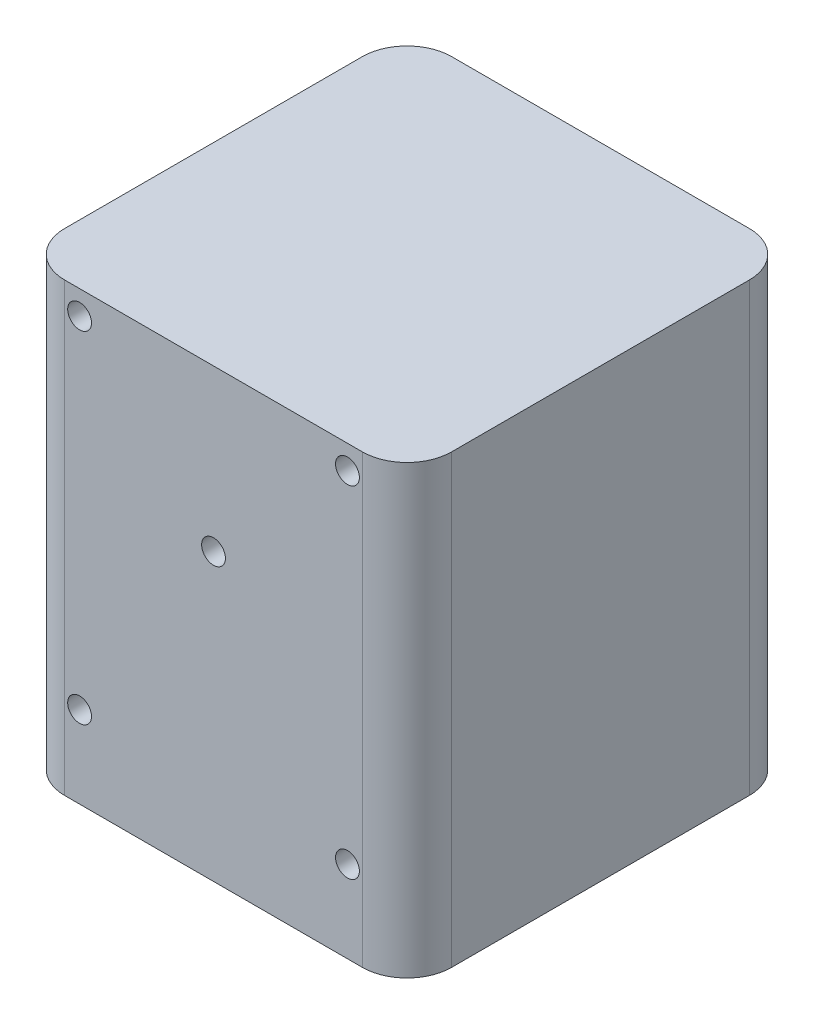
ISO-10303-21;
HEADER;
FILE_DESCRIPTION(('STEP AP214'),'2;1');
FILE_NAME('part.step','',(''),(''),'','','');
FILE_SCHEMA(('AUTOMOTIVE_DESIGN { 1 0 10303 214 1 1 1 1 }'));
ENDSEC;
DATA;
#1=APPLICATION_CONTEXT('core data for automotive mechanical design processes');
#2=APPLICATION_PROTOCOL_DEFINITION('international standard','automotive_design',2000,#1);
#3=PRODUCT_CONTEXT('',#1,'mechanical');
#4=PRODUCT('Part','Part','',(#3));
#5=PRODUCT_RELATED_PRODUCT_CATEGORY('part','',(#4));
#6=PRODUCT_DEFINITION_FORMATION('','',#4);
#7=PRODUCT_DEFINITION_CONTEXT('part definition',#1,'design');
#8=PRODUCT_DEFINITION('design','',#6,#7);
#9=PRODUCT_DEFINITION_SHAPE('','',#8);
#10=(LENGTH_UNIT() NAMED_UNIT(*) SI_UNIT(.MILLI.,.METRE.));
#11=(NAMED_UNIT(*) PLANE_ANGLE_UNIT() SI_UNIT($,.RADIAN.));
#12=(NAMED_UNIT(*) SI_UNIT($,.STERADIAN.) SOLID_ANGLE_UNIT());
#13=UNCERTAINTY_MEASURE_WITH_UNIT(LENGTH_MEASURE(1.E-05),#10,'distance_accuracy_value','');
#14=(GEOMETRIC_REPRESENTATION_CONTEXT(3) GLOBAL_UNCERTAINTY_ASSIGNED_CONTEXT((#13)) GLOBAL_UNIT_ASSIGNED_CONTEXT((#10,
#11,#12)) REPRESENTATION_CONTEXT('',''));
#15=CARTESIAN_POINT('',(0.,0.,0.));
#16=DIRECTION('',(0.,0.,1.));
#17=DIRECTION('',(1.,0.,0.));
#18=AXIS2_PLACEMENT_3D('',#15,#16,#17);
#19=CARTESIAN_POINT('',(-13.,15.,-13.));
#20=DIRECTION('',(0.,0.,1.));
#21=DIRECTION('',(1.,0.,0.));
#22=AXIS2_PLACEMENT_3D('',#19,#20,#21);
#23=PLANE('',#22);
#24=CARTESIAN_POINT('',(-9.,13.4,-13.));
#25=DIRECTION('',(0.,0.,-1.));
#26=DIRECTION('',(-1.,0.,0.));
#27=AXIS2_PLACEMENT_3D('',#24,#25,#26);
#28=CIRCLE('',#27,0.799999999999999);
#29=CARTESIAN_POINT('',(-9.8,13.4,-13.));
#30=VERTEX_POINT('',#29);
#31=EDGE_CURVE('E139',#30,#30,#28,.T.);
#32=ORIENTED_EDGE('',*,*,#31,.F.);
#33=EDGE_LOOP('',(#32));
#34=FACE_BOUND('',#33,.T.);
#35=CARTESIAN_POINT('',(9.,13.4,-13.));
#36=DIRECTION('',(0.,0.,-1.));
#37=DIRECTION('',(-1.,0.,0.));
#38=AXIS2_PLACEMENT_3D('',#35,#36,#37);
#39=CIRCLE('',#38,0.799999999999999);
#40=CARTESIAN_POINT('',(8.2,13.4,-13.));
#41=VERTEX_POINT('',#40);
#42=EDGE_CURVE('E138',#41,#41,#39,.T.);
#43=ORIENTED_EDGE('',*,*,#42,.F.);
#44=EDGE_LOOP('',(#43));
#45=FACE_BOUND('',#44,.T.);
#46=CARTESIAN_POINT('',(-9.,-9.5,-13.));
#47=DIRECTION('',(0.,0.,-1.));
#48=DIRECTION('',(-1.,0.,0.));
#49=AXIS2_PLACEMENT_3D('',#46,#47,#48);
#50=CIRCLE('',#49,0.799999999999999);
#51=CARTESIAN_POINT('',(-9.8,-9.5,-13.));
#52=VERTEX_POINT('',#51);
#53=EDGE_CURVE('E155',#52,#52,#50,.T.);
#54=ORIENTED_EDGE('',*,*,#53,.F.);
#55=EDGE_LOOP('',(#54));
#56=FACE_BOUND('',#55,.T.);
#57=CARTESIAN_POINT('',(9.,-9.5,-13.));
#58=DIRECTION('',(0.,0.,-1.));
#59=DIRECTION('',(-1.,0.,0.));
#60=AXIS2_PLACEMENT_3D('',#57,#58,#59);
#61=CIRCLE('',#60,0.799999999999999);
#62=CARTESIAN_POINT('',(8.2,-9.5,-13.));
#63=VERTEX_POINT('',#62);
#64=EDGE_CURVE('E161',#63,#63,#61,.T.);
#65=ORIENTED_EDGE('',*,*,#64,.F.);
#66=EDGE_LOOP('',(#65));
#67=FACE_BOUND('',#66,.T.);
#68=DIRECTION('',(-1.,0.,0.));
#69=VECTOR('',#68,1.);
#70=CARTESIAN_POINT('',(-13.,-15.,-13.));
#71=LINE('',#70,#69);
#72=CARTESIAN_POINT('',(9.99999999999999,-15.,-13.));
#73=VERTEX_POINT('',#72);
#74=CARTESIAN_POINT('',(-10.,-15.,-13.));
#75=VERTEX_POINT('',#74);
#76=EDGE_CURVE('E218',#73,#75,#71,.T.);
#77=ORIENTED_EDGE('',*,*,#76,.T.);
#78=DIRECTION('',(0.,-1.,0.));
#79=VECTOR('',#78,1.);
#80=CARTESIAN_POINT('',(-10.,15.,-13.));
#81=LINE('',#80,#79);
#82=CARTESIAN_POINT('',(-10.,15.,-13.));
#83=VERTEX_POINT('',#82);
#84=EDGE_CURVE('E240',#75,#83,#81,.F.);
#85=ORIENTED_EDGE('',*,*,#84,.T.);
#86=DIRECTION('',(-1.,0.,0.));
#87=VECTOR('',#86,1.);
#88=CARTESIAN_POINT('',(-13.,15.,-13.));
#89=LINE('',#88,#87);
#90=CARTESIAN_POINT('',(9.99999999999999,15.,-13.));
#91=VERTEX_POINT('',#90);
#92=EDGE_CURVE('E207',#91,#83,#89,.T.);
#93=ORIENTED_EDGE('',*,*,#92,.F.);
#94=DIRECTION('',(0.,-1.,0.));
#95=VECTOR('',#94,1.);
#96=CARTESIAN_POINT('',(9.99999999999999,15.,-13.));
#97=LINE('',#96,#95);
#98=EDGE_CURVE('E237',#91,#73,#97,.T.);
#99=ORIENTED_EDGE('',*,*,#98,.T.);
#100=EDGE_LOOP('',(#77,#85,#93,#99));
#101=FACE_BOUND('',#100,.T.);
#102=CARTESIAN_POINT('',(0.,4.2,-13.));
#103=DIRECTION('',(0.,0.,-1.));
#104=DIRECTION('',(-1.,0.,0.));
#105=AXIS2_PLACEMENT_3D('',#102,#103,#104);
#106=CIRCLE('',#105,0.799999999999998);
#107=CARTESIAN_POINT('',(-0.799999999999998,4.2,-13.));
#108=VERTEX_POINT('',#107);
#109=EDGE_CURVE('E149',#108,#108,#106,.T.);
#110=ORIENTED_EDGE('',*,*,#109,.F.);
#111=EDGE_LOOP('',(#110));
#112=FACE_BOUND('',#111,.T.);
#113=ADVANCED_FACE('F34',(#34,#45,#56,#67,#101,#112),#23,.F.);
#114=CARTESIAN_POINT('',(13.,15.,-13.));
#115=DIRECTION('',(-1.,0.,0.));
#116=DIRECTION('',(0.,0.,1.));
#117=AXIS2_PLACEMENT_3D('',#114,#115,#116);
#118=PLANE('',#117);
#119=DIRECTION('',(0.,0.,-1.));
#120=VECTOR('',#119,1.);
#121=CARTESIAN_POINT('',(13.,-15.,-13.));
#122=LINE('',#121,#120);
#123=CARTESIAN_POINT('',(13.,-15.,9.99999999999999));
#124=VERTEX_POINT('',#123);
#125=CARTESIAN_POINT('',(13.,-15.,-10.));
#126=VERTEX_POINT('',#125);
#127=EDGE_CURVE('E201',#124,#126,#122,.T.);
#128=ORIENTED_EDGE('',*,*,#127,.T.);
#129=DIRECTION('',(0.,-1.,0.));
#130=VECTOR('',#129,1.);
#131=CARTESIAN_POINT('',(13.,15.,-10.));
#132=LINE('',#131,#130);
#133=CARTESIAN_POINT('',(13.,15.,-10.));
#134=VERTEX_POINT('',#133);
#135=EDGE_CURVE('E252',#126,#134,#132,.F.);
#136=ORIENTED_EDGE('',*,*,#135,.T.);
#137=DIRECTION('',(0.,0.,-1.));
#138=VECTOR('',#137,1.);
#139=CARTESIAN_POINT('',(13.,15.,-13.));
#140=LINE('',#139,#138);
#141=CARTESIAN_POINT('',(13.,15.,9.99999999999999));
#142=VERTEX_POINT('',#141);
#143=EDGE_CURVE('E204',#142,#134,#140,.T.);
#144=ORIENTED_EDGE('',*,*,#143,.F.);
#145=DIRECTION('',(0.,-1.,0.));
#146=VECTOR('',#145,1.);
#147=CARTESIAN_POINT('',(13.,15.,10.));
#148=LINE('',#147,#146);
#149=EDGE_CURVE('E249',#142,#124,#148,.T.);
#150=ORIENTED_EDGE('',*,*,#149,.T.);
#151=EDGE_LOOP('',(#128,#136,#144,#150));
#152=FACE_BOUND('',#151,.T.);
#153=ADVANCED_FACE('F256',(#152),#118,.F.);
#154=CARTESIAN_POINT('',(-13.,15.,-13.));
#155=DIRECTION('',(1.,0.,0.));
#156=DIRECTION('',(0.,0.,-1.));
#157=AXIS2_PLACEMENT_3D('',#154,#155,#156);
#158=PLANE('',#157);
#159=DIRECTION('',(0.,0.,1.));
#160=VECTOR('',#159,1.);
#161=CARTESIAN_POINT('',(-13.,15.,-13.));
#162=LINE('',#161,#160);
#163=CARTESIAN_POINT('',(-13.,15.,-10.));
#164=VERTEX_POINT('',#163);
#165=CARTESIAN_POINT('',(-13.,15.,9.99999999999999));
#166=VERTEX_POINT('',#165);
#167=EDGE_CURVE('E211',#164,#166,#162,.T.);
#168=ORIENTED_EDGE('',*,*,#167,.F.);
#169=DIRECTION('',(0.,-1.,0.));
#170=VECTOR('',#169,1.);
#171=CARTESIAN_POINT('',(-13.,15.,-10.));
#172=LINE('',#171,#170);
#173=CARTESIAN_POINT('',(-13.,-15.,-10.));
#174=VERTEX_POINT('',#173);
#175=EDGE_CURVE('E226',#164,#174,#172,.T.);
#176=ORIENTED_EDGE('',*,*,#175,.T.);
#177=DIRECTION('',(0.,0.,1.));
#178=VECTOR('',#177,1.);
#179=CARTESIAN_POINT('',(-13.,-15.,-13.));
#180=LINE('',#179,#178);
#181=CARTESIAN_POINT('',(-13.,-15.,9.99999999999999));
#182=VERTEX_POINT('',#181);
#183=EDGE_CURVE('E221',#174,#182,#180,.T.);
#184=ORIENTED_EDGE('',*,*,#183,.T.);
#185=DIRECTION('',(0.,-1.,0.));
#186=VECTOR('',#185,1.);
#187=CARTESIAN_POINT('',(-13.,15.,10.));
#188=LINE('',#187,#186);
#189=EDGE_CURVE('E215',#182,#166,#188,.F.);
#190=ORIENTED_EDGE('',*,*,#189,.T.);
#191=EDGE_LOOP('',(#168,#176,#184,#190));
#192=FACE_BOUND('',#191,.T.);
#193=ADVANCED_FACE('F279',(#192),#158,.F.);
#194=CARTESIAN_POINT('',(-13.,15.,13.));
#195=DIRECTION('',(0.,0.,-1.));
#196=DIRECTION('',(-1.,0.,0.));
#197=AXIS2_PLACEMENT_3D('',#194,#195,#196);
#198=PLANE('',#197);
#199=CARTESIAN_POINT('',(-9.,13.4,13.));
#200=DIRECTION('',(0.,0.,1.));
#201=DIRECTION('',(1.,0.,0.));
#202=AXIS2_PLACEMENT_3D('',#199,#200,#201);
#203=CIRCLE('',#202,0.799999999999999);
#204=CARTESIAN_POINT('',(-8.2,13.4,13.));
#205=VERTEX_POINT('',#204);
#206=EDGE_CURVE('E167',#205,#205,#203,.T.);
#207=ORIENTED_EDGE('',*,*,#206,.F.);
#208=EDGE_LOOP('',(#207));
#209=FACE_BOUND('',#208,.T.);
#210=CARTESIAN_POINT('',(9.,13.4,13.));
#211=DIRECTION('',(0.,0.,1.));
#212=DIRECTION('',(1.,0.,0.));
#213=AXIS2_PLACEMENT_3D('',#210,#211,#212);
#214=CIRCLE('',#213,0.799999999999999);
#215=CARTESIAN_POINT('',(9.8,13.4,13.));
#216=VERTEX_POINT('',#215);
#217=EDGE_CURVE('E173',#216,#216,#214,.T.);
#218=ORIENTED_EDGE('',*,*,#217,.F.);
#219=EDGE_LOOP('',(#218));
#220=FACE_BOUND('',#219,.T.);
#221=CARTESIAN_POINT('',(0.,4.2,13.));
#222=DIRECTION('',(0.,0.,1.));
#223=DIRECTION('',(1.,0.,0.));
#224=AXIS2_PLACEMENT_3D('',#221,#222,#223);
#225=CIRCLE('',#224,0.799999999999998);
#226=CARTESIAN_POINT('',(0.799999999999998,4.2,13.));
#227=VERTEX_POINT('',#226);
#228=EDGE_CURVE('E179',#227,#227,#225,.T.);
#229=ORIENTED_EDGE('',*,*,#228,.F.);
#230=EDGE_LOOP('',(#229));
#231=FACE_BOUND('',#230,.T.);
#232=CARTESIAN_POINT('',(-9.,-9.5,13.));
#233=DIRECTION('',(0.,0.,1.));
#234=DIRECTION('',(1.,0.,0.));
#235=AXIS2_PLACEMENT_3D('',#232,#233,#234);
#236=CIRCLE('',#235,0.799999999999999);
#237=CARTESIAN_POINT('',(-8.2,-9.5,13.));
#238=VERTEX_POINT('',#237);
#239=EDGE_CURVE('E185',#238,#238,#236,.T.);
#240=ORIENTED_EDGE('',*,*,#239,.F.);
#241=EDGE_LOOP('',(#240));
#242=FACE_BOUND('',#241,.T.);
#243=CARTESIAN_POINT('',(9.,-9.5,13.));
#244=DIRECTION('',(0.,0.,1.));
#245=DIRECTION('',(1.,0.,0.));
#246=AXIS2_PLACEMENT_3D('',#243,#244,#245);
#247=CIRCLE('',#246,0.799999999999999);
#248=CARTESIAN_POINT('',(9.8,-9.5,13.));
#249=VERTEX_POINT('',#248);
#250=EDGE_CURVE('E191',#249,#249,#247,.T.);
#251=ORIENTED_EDGE('',*,*,#250,.F.);
#252=EDGE_LOOP('',(#251));
#253=FACE_BOUND('',#252,.T.);
#254=DIRECTION('',(1.,0.,0.));
#255=VECTOR('',#254,1.);
#256=CARTESIAN_POINT('',(-13.,15.,13.));
#257=LINE('',#256,#255);
#258=CARTESIAN_POINT('',(-10.,15.,13.));
#259=VERTEX_POINT('',#258);
#260=CARTESIAN_POINT('',(9.99999999999999,15.,13.));
#261=VERTEX_POINT('',#260);
#262=EDGE_CURVE('E213',#259,#261,#257,.T.);
#263=ORIENTED_EDGE('',*,*,#262,.F.);
#264=DIRECTION('',(0.,-1.,0.));
#265=VECTOR('',#264,1.);
#266=CARTESIAN_POINT('',(-10.,15.,13.));
#267=LINE('',#266,#265);
#268=CARTESIAN_POINT('',(-10.,-15.,13.));
#269=VERTEX_POINT('',#268);
#270=EDGE_CURVE('E11',#259,#269,#267,.T.);
#271=ORIENTED_EDGE('',*,*,#270,.T.);
#272=DIRECTION('',(1.,0.,0.));
#273=VECTOR('',#272,1.);
#274=CARTESIAN_POINT('',(-13.,-15.,13.));
#275=LINE('',#274,#273);
#276=CARTESIAN_POINT('',(9.99999999999999,-15.,13.));
#277=VERTEX_POINT('',#276);
#278=EDGE_CURVE('E208',#269,#277,#275,.T.);
#279=ORIENTED_EDGE('',*,*,#278,.T.);
#280=DIRECTION('',(0.,-1.,0.));
#281=VECTOR('',#280,1.);
#282=CARTESIAN_POINT('',(10.,15.,13.));
#283=LINE('',#282,#281);
#284=EDGE_CURVE('E42',#277,#261,#283,.F.);
#285=ORIENTED_EDGE('',*,*,#284,.T.);
#286=EDGE_LOOP('',(#263,#271,#279,#285));
#287=FACE_BOUND('',#286,.T.);
#288=ADVANCED_FACE('F285',(#209,#220,#231,#242,#253,#287),#198,.F.);
#289=CARTESIAN_POINT('',(0.,15.,0.));
#290=DIRECTION('',(0.,1.,0.));
#291=DIRECTION('',(0.,0.,1.));
#292=AXIS2_PLACEMENT_3D('',#289,#290,#291);
#293=PLANE('',#292);
#294=ORIENTED_EDGE('',*,*,#92,.T.);
#295=CARTESIAN_POINT('',(-10.,15.,-10.));
#296=DIRECTION('',(0.,1.,0.));
#297=DIRECTION('',(0.,0.,1.));
#298=AXIS2_PLACEMENT_3D('',#295,#296,#297);
#299=CIRCLE('',#298,3.);
#300=EDGE_CURVE('E247',#83,#164,#299,.T.);
#301=ORIENTED_EDGE('',*,*,#300,.T.);
#302=ORIENTED_EDGE('',*,*,#167,.T.);
#303=CARTESIAN_POINT('',(-10.,15.,10.));
#304=DIRECTION('',(0.,1.,0.));
#305=DIRECTION('',(0.,0.,1.));
#306=AXIS2_PLACEMENT_3D('',#303,#304,#305);
#307=CIRCLE('',#306,3.);
#308=EDGE_CURVE('E55',#166,#259,#307,.T.);
#309=ORIENTED_EDGE('',*,*,#308,.T.);
#310=ORIENTED_EDGE('',*,*,#262,.T.);
#311=CARTESIAN_POINT('',(10.,15.,10.));
#312=DIRECTION('',(0.,1.,0.));
#313=DIRECTION('',(0.,0.,1.));
#314=AXIS2_PLACEMENT_3D('',#311,#312,#313);
#315=CIRCLE('',#314,3.);
#316=EDGE_CURVE('E242',#261,#142,#315,.T.);
#317=ORIENTED_EDGE('',*,*,#316,.T.);
#318=ORIENTED_EDGE('',*,*,#143,.T.);
#319=CARTESIAN_POINT('',(9.99999999999999,15.,-10.));
#320=DIRECTION('',(0.,1.,0.));
#321=DIRECTION('',(0.,0.,1.));
#322=AXIS2_PLACEMENT_3D('',#319,#320,#321);
#323=CIRCLE('',#322,3.);
#324=EDGE_CURVE('E245',#134,#91,#323,.T.);
#325=ORIENTED_EDGE('',*,*,#324,.T.);
#326=EDGE_LOOP('',(#294,#301,#302,#309,#310,#317,#318,#325));
#327=FACE_BOUND('',#326,.T.);
#328=ADVANCED_FACE('F261',(#327),#293,.T.);
#329=CARTESIAN_POINT('',(0.,-15.,0.));
#330=DIRECTION('',(0.,1.,0.));
#331=DIRECTION('',(0.,0.,1.));
#332=AXIS2_PLACEMENT_3D('',#329,#330,#331);
#333=PLANE('',#332);
#334=CARTESIAN_POINT('',(0.,-15.,0.));
#335=DIRECTION('',(0.,-1.,0.));
#336=DIRECTION('',(0.,0.,-1.));
#337=AXIS2_PLACEMENT_3D('',#334,#335,#336);
#338=CIRCLE('',#337,12.);
#339=CARTESIAN_POINT('',(0.,-15.,-12.));
#340=VERTEX_POINT('',#339);
#341=EDGE_CURVE('E197',#340,#340,#338,.T.);
#342=ORIENTED_EDGE('',*,*,#341,.F.);
#343=EDGE_LOOP('',(#342));
#344=FACE_BOUND('',#343,.T.);
#345=ORIENTED_EDGE('',*,*,#183,.F.);
#346=CARTESIAN_POINT('',(-10.,-15.,-10.));
#347=DIRECTION('',(0.,1.,0.));
#348=DIRECTION('',(0.,0.,1.));
#349=AXIS2_PLACEMENT_3D('',#346,#347,#348);
#350=CIRCLE('',#349,3.);
#351=EDGE_CURVE('E235',#174,#75,#350,.F.);
#352=ORIENTED_EDGE('',*,*,#351,.T.);
#353=ORIENTED_EDGE('',*,*,#76,.F.);
#354=CARTESIAN_POINT('',(9.99999999999999,-15.,-10.));
#355=DIRECTION('',(0.,1.,0.));
#356=DIRECTION('',(0.,0.,1.));
#357=AXIS2_PLACEMENT_3D('',#354,#355,#356);
#358=CIRCLE('',#357,3.);
#359=EDGE_CURVE('E233',#73,#126,#358,.F.);
#360=ORIENTED_EDGE('',*,*,#359,.T.);
#361=ORIENTED_EDGE('',*,*,#127,.F.);
#362=CARTESIAN_POINT('',(10.,-15.,10.));
#363=DIRECTION('',(0.,1.,0.));
#364=DIRECTION('',(0.,0.,1.));
#365=AXIS2_PLACEMENT_3D('',#362,#363,#364);
#366=CIRCLE('',#365,3.);
#367=EDGE_CURVE('E229',#124,#277,#366,.F.);
#368=ORIENTED_EDGE('',*,*,#367,.T.);
#369=ORIENTED_EDGE('',*,*,#278,.F.);
#370=CARTESIAN_POINT('',(-10.,-15.,10.));
#371=DIRECTION('',(0.,1.,0.));
#372=DIRECTION('',(0.,0.,1.));
#373=AXIS2_PLACEMENT_3D('',#370,#371,#372);
#374=CIRCLE('',#373,3.);
#375=EDGE_CURVE('E231',#269,#182,#374,.F.);
#376=ORIENTED_EDGE('',*,*,#375,.T.);
#377=EDGE_LOOP('',(#345,#352,#353,#360,#361,#368,#369,#376));
#378=FACE_BOUND('',#377,.T.);
#379=ADVANCED_FACE('F272',(#344,#378),#333,.F.);
#380=CARTESIAN_POINT('',(-10.,15.,-10.));
#381=DIRECTION('',(0.,-1.,0.));
#382=DIRECTION('',(0.,0.,-1.));
#383=AXIS2_PLACEMENT_3D('',#380,#381,#382);
#384=CYLINDRICAL_SURFACE('',#383,3.);
#385=ORIENTED_EDGE('',*,*,#300,.F.);
#386=ORIENTED_EDGE('',*,*,#84,.F.);
#387=ORIENTED_EDGE('',*,*,#351,.F.);
#388=ORIENTED_EDGE('',*,*,#175,.F.);
#389=EDGE_LOOP('',(#385,#386,#387,#388));
#390=FACE_BOUND('',#389,.T.);
#391=ADVANCED_FACE('F276',(#390),#384,.T.);
#392=CARTESIAN_POINT('',(9.99999999999999,15.,-10.));
#393=DIRECTION('',(0.,-1.,0.));
#394=DIRECTION('',(0.,0.,-1.));
#395=AXIS2_PLACEMENT_3D('',#392,#393,#394);
#396=CYLINDRICAL_SURFACE('',#395,3.);
#397=ORIENTED_EDGE('',*,*,#324,.F.);
#398=ORIENTED_EDGE('',*,*,#135,.F.);
#399=ORIENTED_EDGE('',*,*,#359,.F.);
#400=ORIENTED_EDGE('',*,*,#98,.F.);
#401=EDGE_LOOP('',(#397,#398,#399,#400));
#402=FACE_BOUND('',#401,.T.);
#403=ADVANCED_FACE('F265',(#402),#396,.T.);
#404=CARTESIAN_POINT('',(-10.,15.,10.));
#405=DIRECTION('',(0.,-1.,0.));
#406=DIRECTION('',(0.,0.,-1.));
#407=AXIS2_PLACEMENT_3D('',#404,#405,#406);
#408=CYLINDRICAL_SURFACE('',#407,3.);
#409=ORIENTED_EDGE('',*,*,#308,.F.);
#410=ORIENTED_EDGE('',*,*,#189,.F.);
#411=ORIENTED_EDGE('',*,*,#375,.F.);
#412=ORIENTED_EDGE('',*,*,#270,.F.);
#413=EDGE_LOOP('',(#409,#410,#411,#412));
#414=FACE_BOUND('',#413,.T.);
#415=ADVANCED_FACE('F283',(#414),#408,.T.);
#416=CARTESIAN_POINT('',(10.,15.,10.));
#417=DIRECTION('',(0.,-1.,0.));
#418=DIRECTION('',(0.,0.,-1.));
#419=AXIS2_PLACEMENT_3D('',#416,#417,#418);
#420=CYLINDRICAL_SURFACE('',#419,3.);
#421=ORIENTED_EDGE('',*,*,#316,.F.);
#422=ORIENTED_EDGE('',*,*,#284,.F.);
#423=ORIENTED_EDGE('',*,*,#367,.F.);
#424=ORIENTED_EDGE('',*,*,#149,.F.);
#425=EDGE_LOOP('',(#421,#422,#423,#424));
#426=FACE_BOUND('',#425,.T.);
#427=ADVANCED_FACE('F36',(#426),#420,.T.);
#428=CARTESIAN_POINT('',(0.,-5.,0.));
#429=DIRECTION('',(0.,-1.,0.));
#430=DIRECTION('',(0.,0.,-1.));
#431=AXIS2_PLACEMENT_3D('',#428,#429,#430);
#432=CYLINDRICAL_SURFACE('',#431,12.);
#433=CARTESIAN_POINT('',(0.,-5.,0.));
#434=DIRECTION('',(0.,-1.,0.));
#435=DIRECTION('',(0.,0.,-1.));
#436=AXIS2_PLACEMENT_3D('',#433,#434,#435);
#437=CIRCLE('',#436,12.);
#438=CARTESIAN_POINT('',(0.,-5.,-12.));
#439=VERTEX_POINT('',#438);
#440=EDGE_CURVE('E198',#439,#439,#437,.T.);
#441=ORIENTED_EDGE('',*,*,#440,.F.);
#442=EDGE_LOOP('',(#441));
#443=FACE_BOUND('',#442,.T.);
#444=ORIENTED_EDGE('',*,*,#341,.T.);
#445=EDGE_LOOP('',(#444));
#446=FACE_BOUND('',#445,.T.);
#447=ADVANCED_FACE('F288',(#443,#446),#432,.F.);
#448=CARTESIAN_POINT('',(0.,-5.,0.));
#449=DIRECTION('',(0.,-1.,0.));
#450=DIRECTION('',(0.,0.,-1.));
#451=AXIS2_PLACEMENT_3D('',#448,#449,#450);
#452=PLANE('',#451);
#453=ORIENTED_EDGE('',*,*,#440,.T.);
#454=EDGE_LOOP('',(#453));
#455=FACE_BOUND('',#454,.T.);
#456=ADVANCED_FACE('F293',(#455),#452,.T.);
#457=CARTESIAN_POINT('',(9.,-9.5,10.5));
#458=DIRECTION('',(0.,0.,1.));
#459=DIRECTION('',(1.,0.,0.));
#460=AXIS2_PLACEMENT_3D('',#457,#458,#459);
#461=CONICAL_SURFACE('',#460,0.799999999999999,1.02974425867665);
#462=CARTESIAN_POINT('',(9.,-9.5,10.019311504778));
#463=VERTEX_POINT('',#462);
#464=VERTEX_LOOP('',#463);
#465=FACE_BOUND('',#464,.T.);
#466=CARTESIAN_POINT('',(9.,-9.5,10.5));
#467=DIRECTION('',(0.,0.,1.));
#468=DIRECTION('',(1.,0.,0.));
#469=AXIS2_PLACEMENT_3D('',#466,#467,#468);
#470=CIRCLE('',#469,0.799999999999999);
#471=CARTESIAN_POINT('',(9.8,-9.5,10.5));
#472=VERTEX_POINT('',#471);
#473=EDGE_CURVE('E194',#472,#472,#470,.T.);
#474=ORIENTED_EDGE('',*,*,#473,.T.);
#475=EDGE_LOOP('',(#474));
#476=FACE_BOUND('',#475,.T.);
#477=ADVANCED_FACE('F351',(#465,#476),#461,.F.);
#478=CARTESIAN_POINT('',(9.,-9.5,13.));
#479=DIRECTION('',(0.,0.,1.));
#480=DIRECTION('',(1.,0.,0.));
#481=AXIS2_PLACEMENT_3D('',#478,#479,#480);
#482=CYLINDRICAL_SURFACE('',#481,0.799999999999999);
#483=ORIENTED_EDGE('',*,*,#473,.F.);
#484=EDGE_LOOP('',(#483));
#485=FACE_BOUND('',#484,.T.);
#486=ORIENTED_EDGE('',*,*,#250,.T.);
#487=EDGE_LOOP('',(#486));
#488=FACE_BOUND('',#487,.T.);
#489=ADVANCED_FACE('F372',(#485,#488),#482,.F.);
#490=CARTESIAN_POINT('',(-9.,-9.5,10.5));
#491=DIRECTION('',(0.,0.,1.));
#492=DIRECTION('',(1.,0.,0.));
#493=AXIS2_PLACEMENT_3D('',#490,#491,#492);
#494=CONICAL_SURFACE('',#493,0.799999999999999,1.02974425867665);
#495=CARTESIAN_POINT('',(-9.,-9.5,10.019311504778));
#496=VERTEX_POINT('',#495);
#497=VERTEX_LOOP('',#496);
#498=FACE_BOUND('',#497,.T.);
#499=CARTESIAN_POINT('',(-9.,-9.5,10.5));
#500=DIRECTION('',(0.,0.,1.));
#501=DIRECTION('',(1.,0.,0.));
#502=AXIS2_PLACEMENT_3D('',#499,#500,#501);
#503=CIRCLE('',#502,0.799999999999999);
#504=CARTESIAN_POINT('',(-8.2,-9.5,10.5));
#505=VERTEX_POINT('',#504);
#506=EDGE_CURVE('E188',#505,#505,#503,.T.);
#507=ORIENTED_EDGE('',*,*,#506,.T.);
#508=EDGE_LOOP('',(#507));
#509=FACE_BOUND('',#508,.T.);
#510=ADVANCED_FACE('F383',(#498,#509),#494,.F.);
#511=CARTESIAN_POINT('',(-9.,-9.5,13.));
#512=DIRECTION('',(0.,0.,1.));
#513=DIRECTION('',(1.,0.,0.));
#514=AXIS2_PLACEMENT_3D('',#511,#512,#513);
#515=CYLINDRICAL_SURFACE('',#514,0.799999999999999);
#516=ORIENTED_EDGE('',*,*,#506,.F.);
#517=EDGE_LOOP('',(#516));
#518=FACE_BOUND('',#517,.T.);
#519=ORIENTED_EDGE('',*,*,#239,.T.);
#520=EDGE_LOOP('',(#519));
#521=FACE_BOUND('',#520,.T.);
#522=ADVANCED_FACE('F394',(#518,#521),#515,.F.);
#523=CARTESIAN_POINT('',(0.,4.2,10.5));
#524=DIRECTION('',(0.,0.,1.));
#525=DIRECTION('',(1.,0.,0.));
#526=AXIS2_PLACEMENT_3D('',#523,#524,#525);
#527=CONICAL_SURFACE('',#526,0.799999999999999,1.02974425867665);
#528=CARTESIAN_POINT('',(0.,4.2,10.019311504778));
#529=VERTEX_POINT('',#528);
#530=VERTEX_LOOP('',#529);
#531=FACE_BOUND('',#530,.T.);
#532=CARTESIAN_POINT('',(0.,4.2,10.5));
#533=DIRECTION('',(0.,0.,1.));
#534=DIRECTION('',(1.,0.,0.));
#535=AXIS2_PLACEMENT_3D('',#532,#533,#534);
#536=CIRCLE('',#535,0.799999999999999);
#537=CARTESIAN_POINT('',(0.799999999999999,4.2,10.5));
#538=VERTEX_POINT('',#537);
#539=EDGE_CURVE('E182',#538,#538,#536,.T.);
#540=ORIENTED_EDGE('',*,*,#539,.T.);
#541=EDGE_LOOP('',(#540));
#542=FACE_BOUND('',#541,.T.);
#543=ADVANCED_FACE('F404',(#531,#542),#527,.F.);
#544=CARTESIAN_POINT('',(0.,4.2,13.));
#545=DIRECTION('',(0.,0.,1.));
#546=DIRECTION('',(1.,0.,0.));
#547=AXIS2_PLACEMENT_3D('',#544,#545,#546);
#548=CYLINDRICAL_SURFACE('',#547,0.799999999999999);
#549=ORIENTED_EDGE('',*,*,#539,.F.);
#550=EDGE_LOOP('',(#549));
#551=FACE_BOUND('',#550,.T.);
#552=ORIENTED_EDGE('',*,*,#228,.T.);
#553=EDGE_LOOP('',(#552));
#554=FACE_BOUND('',#553,.T.);
#555=ADVANCED_FACE('F415',(#551,#554),#548,.F.);
#556=CARTESIAN_POINT('',(9.,13.4,10.5));
#557=DIRECTION('',(0.,0.,1.));
#558=DIRECTION('',(1.,0.,0.));
#559=AXIS2_PLACEMENT_3D('',#556,#557,#558);
#560=CONICAL_SURFACE('',#559,0.799999999999999,1.02974425867665);
#561=CARTESIAN_POINT('',(9.,13.4,10.019311504778));
#562=VERTEX_POINT('',#561);
#563=VERTEX_LOOP('',#562);
#564=FACE_BOUND('',#563,.T.);
#565=CARTESIAN_POINT('',(9.,13.4,10.5));
#566=DIRECTION('',(0.,0.,1.));
#567=DIRECTION('',(1.,0.,0.));
#568=AXIS2_PLACEMENT_3D('',#565,#566,#567);
#569=CIRCLE('',#568,0.799999999999999);
#570=CARTESIAN_POINT('',(9.8,13.4,10.5));
#571=VERTEX_POINT('',#570);
#572=EDGE_CURVE('E176',#571,#571,#569,.T.);
#573=ORIENTED_EDGE('',*,*,#572,.T.);
#574=EDGE_LOOP('',(#573));
#575=FACE_BOUND('',#574,.T.);
#576=ADVANCED_FACE('F425',(#564,#575),#560,.F.);
#577=CARTESIAN_POINT('',(9.,13.4,13.));
#578=DIRECTION('',(0.,0.,1.));
#579=DIRECTION('',(1.,0.,0.));
#580=AXIS2_PLACEMENT_3D('',#577,#578,#579);
#581=CYLINDRICAL_SURFACE('',#580,0.799999999999999);
#582=ORIENTED_EDGE('',*,*,#572,.F.);
#583=EDGE_LOOP('',(#582));
#584=FACE_BOUND('',#583,.T.);
#585=ORIENTED_EDGE('',*,*,#217,.T.);
#586=EDGE_LOOP('',(#585));
#587=FACE_BOUND('',#586,.T.);
#588=ADVANCED_FACE('F436',(#584,#587),#581,.F.);
#589=CARTESIAN_POINT('',(-9.,13.4,10.5));
#590=DIRECTION('',(0.,0.,1.));
#591=DIRECTION('',(1.,0.,0.));
#592=AXIS2_PLACEMENT_3D('',#589,#590,#591);
#593=CONICAL_SURFACE('',#592,0.799999999999999,1.02974425867665);
#594=CARTESIAN_POINT('',(-9.,13.4,10.019311504778));
#595=VERTEX_POINT('',#594);
#596=VERTEX_LOOP('',#595);
#597=FACE_BOUND('',#596,.T.);
#598=CARTESIAN_POINT('',(-9.,13.4,10.5));
#599=DIRECTION('',(0.,0.,1.));
#600=DIRECTION('',(1.,0.,0.));
#601=AXIS2_PLACEMENT_3D('',#598,#599,#600);
#602=CIRCLE('',#601,0.799999999999999);
#603=CARTESIAN_POINT('',(-8.2,13.4,10.5));
#604=VERTEX_POINT('',#603);
#605=EDGE_CURVE('E170',#604,#604,#602,.T.);
#606=ORIENTED_EDGE('',*,*,#605,.T.);
#607=EDGE_LOOP('',(#606));
#608=FACE_BOUND('',#607,.T.);
#609=ADVANCED_FACE('F446',(#597,#608),#593,.F.);
#610=CARTESIAN_POINT('',(-9.,13.4,13.));
#611=DIRECTION('',(0.,0.,1.));
#612=DIRECTION('',(1.,0.,0.));
#613=AXIS2_PLACEMENT_3D('',#610,#611,#612);
#614=CYLINDRICAL_SURFACE('',#613,0.799999999999999);
#615=ORIENTED_EDGE('',*,*,#605,.F.);
#616=EDGE_LOOP('',(#615));
#617=FACE_BOUND('',#616,.T.);
#618=ORIENTED_EDGE('',*,*,#206,.T.);
#619=EDGE_LOOP('',(#618));
#620=FACE_BOUND('',#619,.T.);
#621=ADVANCED_FACE('F457',(#617,#620),#614,.F.);
#622=CARTESIAN_POINT('',(9.,-9.5,-10.5));
#623=DIRECTION('',(0.,0.,-1.));
#624=DIRECTION('',(-1.,0.,0.));
#625=AXIS2_PLACEMENT_3D('',#622,#623,#624);
#626=CONICAL_SURFACE('',#625,0.799999999999999,1.02974425867665);
#627=CARTESIAN_POINT('',(9.,-9.5,-10.019311504778));
#628=VERTEX_POINT('',#627);
#629=VERTEX_LOOP('',#628);
#630=FACE_BOUND('',#629,.T.);
#631=CARTESIAN_POINT('',(9.,-9.5,-10.5));
#632=DIRECTION('',(0.,0.,-1.));
#633=DIRECTION('',(-1.,0.,0.));
#634=AXIS2_PLACEMENT_3D('',#631,#632,#633);
#635=CIRCLE('',#634,0.799999999999999);
#636=CARTESIAN_POINT('',(8.2,-9.5,-10.5));
#637=VERTEX_POINT('',#636);
#638=EDGE_CURVE('E164',#637,#637,#635,.T.);
#639=ORIENTED_EDGE('',*,*,#638,.T.);
#640=EDGE_LOOP('',(#639));
#641=FACE_BOUND('',#640,.T.);
#642=ADVANCED_FACE('F466',(#630,#641),#626,.F.);
#643=CARTESIAN_POINT('',(9.,-9.5,-13.));
#644=DIRECTION('',(0.,0.,-1.));
#645=DIRECTION('',(-1.,0.,0.));
#646=AXIS2_PLACEMENT_3D('',#643,#644,#645);
#647=CYLINDRICAL_SURFACE('',#646,0.799999999999999);
#648=ORIENTED_EDGE('',*,*,#638,.F.);
#649=EDGE_LOOP('',(#648));
#650=FACE_BOUND('',#649,.T.);
#651=ORIENTED_EDGE('',*,*,#64,.T.);
#652=EDGE_LOOP('',(#651));
#653=FACE_BOUND('',#652,.T.);
#654=ADVANCED_FACE('F482',(#650,#653),#647,.F.);
#655=CARTESIAN_POINT('',(-9.,-9.5,-10.5));
#656=DIRECTION('',(0.,0.,-1.));
#657=DIRECTION('',(-1.,0.,0.));
#658=AXIS2_PLACEMENT_3D('',#655,#656,#657);
#659=CONICAL_SURFACE('',#658,0.799999999999999,1.02974425867665);
#660=CARTESIAN_POINT('',(-9.,-9.5,-10.019311504778));
#661=VERTEX_POINT('',#660);
#662=VERTEX_LOOP('',#661);
#663=FACE_BOUND('',#662,.T.);
#664=CARTESIAN_POINT('',(-9.,-9.5,-10.5));
#665=DIRECTION('',(0.,0.,-1.));
#666=DIRECTION('',(-1.,0.,0.));
#667=AXIS2_PLACEMENT_3D('',#664,#665,#666);
#668=CIRCLE('',#667,0.799999999999999);
#669=CARTESIAN_POINT('',(-9.8,-9.5,-10.5));
#670=VERTEX_POINT('',#669);
#671=EDGE_CURVE('E158',#670,#670,#668,.T.);
#672=ORIENTED_EDGE('',*,*,#671,.T.);
#673=EDGE_LOOP('',(#672));
#674=FACE_BOUND('',#673,.T.);
#675=ADVANCED_FACE('F492',(#663,#674),#659,.F.);
#676=CARTESIAN_POINT('',(-9.,-9.5,-13.));
#677=DIRECTION('',(0.,0.,-1.));
#678=DIRECTION('',(-1.,0.,0.));
#679=AXIS2_PLACEMENT_3D('',#676,#677,#678);
#680=CYLINDRICAL_SURFACE('',#679,0.799999999999999);
#681=ORIENTED_EDGE('',*,*,#671,.F.);
#682=EDGE_LOOP('',(#681));
#683=FACE_BOUND('',#682,.T.);
#684=ORIENTED_EDGE('',*,*,#53,.T.);
#685=EDGE_LOOP('',(#684));
#686=FACE_BOUND('',#685,.T.);
#687=ADVANCED_FACE('F503',(#683,#686),#680,.F.);
#688=CARTESIAN_POINT('',(0.,4.2,-10.5));
#689=DIRECTION('',(0.,0.,-1.));
#690=DIRECTION('',(-1.,0.,0.));
#691=AXIS2_PLACEMENT_3D('',#688,#689,#690);
#692=CONICAL_SURFACE('',#691,0.799999999999999,1.02974425867665);
#693=CARTESIAN_POINT('',(0.,4.2,-10.019311504778));
#694=VERTEX_POINT('',#693);
#695=VERTEX_LOOP('',#694);
#696=FACE_BOUND('',#695,.T.);
#697=CARTESIAN_POINT('',(0.,4.2,-10.5));
#698=DIRECTION('',(0.,0.,-1.));
#699=DIRECTION('',(-1.,0.,0.));
#700=AXIS2_PLACEMENT_3D('',#697,#698,#699);
#701=CIRCLE('',#700,0.799999999999999);
#702=CARTESIAN_POINT('',(-0.799999999999999,4.2,-10.5));
#703=VERTEX_POINT('',#702);
#704=EDGE_CURVE('E152',#703,#703,#701,.T.);
#705=ORIENTED_EDGE('',*,*,#704,.T.);
#706=EDGE_LOOP('',(#705));
#707=FACE_BOUND('',#706,.T.);
#708=ADVANCED_FACE('F513',(#696,#707),#692,.F.);
#709=CARTESIAN_POINT('',(0.,4.2,-13.));
#710=DIRECTION('',(0.,0.,-1.));
#711=DIRECTION('',(-1.,0.,0.));
#712=AXIS2_PLACEMENT_3D('',#709,#710,#711);
#713=CYLINDRICAL_SURFACE('',#712,0.799999999999999);
#714=ORIENTED_EDGE('',*,*,#704,.F.);
#715=EDGE_LOOP('',(#714));
#716=FACE_BOUND('',#715,.T.);
#717=ORIENTED_EDGE('',*,*,#109,.T.);
#718=EDGE_LOOP('',(#717));
#719=FACE_BOUND('',#718,.T.);
#720=ADVANCED_FACE('F524',(#716,#719),#713,.F.);
#721=CARTESIAN_POINT('',(9.,13.4,-10.5));
#722=DIRECTION('',(0.,0.,-1.));
#723=DIRECTION('',(-1.,0.,0.));
#724=AXIS2_PLACEMENT_3D('',#721,#722,#723);
#725=CONICAL_SURFACE('',#724,0.799999999999999,1.02974425867665);
#726=CARTESIAN_POINT('',(9.,13.4,-10.019311504778));
#727=VERTEX_POINT('',#726);
#728=VERTEX_LOOP('',#727);
#729=FACE_BOUND('',#728,.T.);
#730=CARTESIAN_POINT('',(9.,13.4,-10.5));
#731=DIRECTION('',(0.,0.,-1.));
#732=DIRECTION('',(-1.,0.,0.));
#733=AXIS2_PLACEMENT_3D('',#730,#731,#732);
#734=CIRCLE('',#733,0.799999999999999);
#735=CARTESIAN_POINT('',(8.2,13.4,-10.5));
#736=VERTEX_POINT('',#735);
#737=EDGE_CURVE('E142',#736,#736,#734,.T.);
#738=ORIENTED_EDGE('',*,*,#737,.T.);
#739=EDGE_LOOP('',(#738));
#740=FACE_BOUND('',#739,.T.);
#741=ADVANCED_FACE('F534',(#729,#740),#725,.F.);
#742=CARTESIAN_POINT('',(9.,13.4,-13.));
#743=DIRECTION('',(0.,0.,-1.));
#744=DIRECTION('',(-1.,0.,0.));
#745=AXIS2_PLACEMENT_3D('',#742,#743,#744);
#746=CYLINDRICAL_SURFACE('',#745,0.799999999999999);
#747=ORIENTED_EDGE('',*,*,#737,.F.);
#748=EDGE_LOOP('',(#747));
#749=FACE_BOUND('',#748,.T.);
#750=ORIENTED_EDGE('',*,*,#42,.T.);
#751=EDGE_LOOP('',(#750));
#752=FACE_BOUND('',#751,.T.);
#753=ADVANCED_FACE('F132',(#749,#752),#746,.F.);
#754=CARTESIAN_POINT('',(-9.,13.4,-10.5));
#755=DIRECTION('',(0.,0.,-1.));
#756=DIRECTION('',(-1.,0.,0.));
#757=AXIS2_PLACEMENT_3D('',#754,#755,#756);
#758=CONICAL_SURFACE('',#757,0.799999999999999,1.02974425867665);
#759=CARTESIAN_POINT('',(-9.,13.4,-10.019311504778));
#760=VERTEX_POINT('',#759);
#761=VERTEX_LOOP('',#760);
#762=FACE_BOUND('',#761,.T.);
#763=CARTESIAN_POINT('',(-9.,13.4,-10.5));
#764=DIRECTION('',(0.,0.,-1.));
#765=DIRECTION('',(-1.,0.,0.));
#766=AXIS2_PLACEMENT_3D('',#763,#764,#765);
#767=CIRCLE('',#766,0.799999999999999);
#768=CARTESIAN_POINT('',(-9.8,13.4,-10.5));
#769=VERTEX_POINT('',#768);
#770=EDGE_CURVE('E136',#769,#769,#767,.T.);
#771=ORIENTED_EDGE('',*,*,#770,.T.);
#772=EDGE_LOOP('',(#771));
#773=FACE_BOUND('',#772,.T.);
#774=ADVANCED_FACE('F128',(#762,#773),#758,.F.);
#775=CARTESIAN_POINT('',(-9.,13.4,-13.));
#776=DIRECTION('',(0.,0.,-1.));
#777=DIRECTION('',(-1.,0.,0.));
#778=AXIS2_PLACEMENT_3D('',#775,#776,#777);
#779=CYLINDRICAL_SURFACE('',#778,0.799999999999999);
#780=ORIENTED_EDGE('',*,*,#770,.F.);
#781=EDGE_LOOP('',(#780));
#782=FACE_BOUND('',#781,.T.);
#783=ORIENTED_EDGE('',*,*,#31,.T.);
#784=EDGE_LOOP('',(#783));
#785=FACE_BOUND('',#784,.T.);
#786=ADVANCED_FACE('F131',(#782,#785),#779,.F.);
#787=CLOSED_SHELL('',(#113,#153,#193,#288,#328,#379,#391,#403,#415,#427,#447,#456,#477,#489,
#510,#522,#543,#555,#576,#588,#609,#621,#642,#654,#675,#687,#708,#720,#741,#753,#774,#786));
#788=MANIFOLD_SOLID_BREP('B2',#787);
#789=ADVANCED_BREP_SHAPE_REPRESENTATION('',(#18,#788),#14);
#790=SHAPE_DEFINITION_REPRESENTATION(#9,#789);
ENDSEC;
END-ISO-10303-21;
